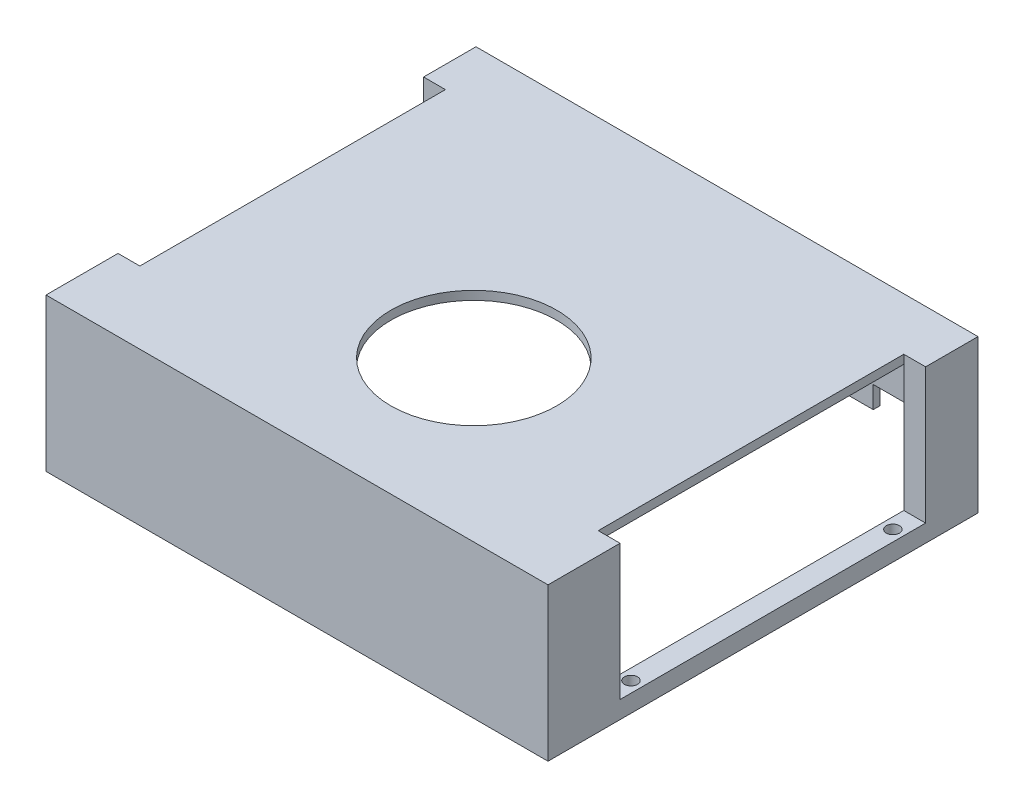
ISO-10303-21;
HEADER;
FILE_DESCRIPTION(('STEP AP214'),'2;1');
FILE_NAME('part.step','',(''),(''),'','','');
FILE_SCHEMA(('AUTOMOTIVE_DESIGN { 1 0 10303 214 1 1 1 1 }'));
ENDSEC;
DATA;
#1=APPLICATION_CONTEXT('core data for automotive mechanical design processes');
#2=APPLICATION_PROTOCOL_DEFINITION('international standard','automotive_design',2000,#1);
#3=PRODUCT_CONTEXT('',#1,'mechanical');
#4=PRODUCT('Part','Part','',(#3));
#5=PRODUCT_RELATED_PRODUCT_CATEGORY('part','',(#4));
#6=PRODUCT_DEFINITION_FORMATION('','',#4);
#7=PRODUCT_DEFINITION_CONTEXT('part definition',#1,'design');
#8=PRODUCT_DEFINITION('design','',#6,#7);
#9=PRODUCT_DEFINITION_SHAPE('','',#8);
#10=(LENGTH_UNIT() NAMED_UNIT(*) SI_UNIT(.MILLI.,.METRE.));
#11=(NAMED_UNIT(*) PLANE_ANGLE_UNIT() SI_UNIT($,.RADIAN.));
#12=(NAMED_UNIT(*) SI_UNIT($,.STERADIAN.) SOLID_ANGLE_UNIT());
#13=UNCERTAINTY_MEASURE_WITH_UNIT(LENGTH_MEASURE(1.E-05),#10,'distance_accuracy_value','');
#14=(GEOMETRIC_REPRESENTATION_CONTEXT(3) GLOBAL_UNCERTAINTY_ASSIGNED_CONTEXT((#13)) GLOBAL_UNIT_ASSIGNED_CONTEXT((#10,
#11,#12)) REPRESENTATION_CONTEXT('',''));
#15=CARTESIAN_POINT('',(0.,0.,0.));
#16=DIRECTION('',(0.,0.,1.));
#17=DIRECTION('',(1.,0.,0.));
#18=AXIS2_PLACEMENT_3D('',#15,#16,#17);
#19=CARTESIAN_POINT('',(-57.5,35.,-57.));
#20=DIRECTION('',(0.,0.,-1.));
#21=DIRECTION('',(-1.,0.,0.));
#22=AXIS2_PLACEMENT_3D('',#19,#20,#21);
#23=PLANE('',#22);
#24=DIRECTION('',(0.,-1.,0.));
#25=VECTOR('',#24,1.);
#26=CARTESIAN_POINT('',(50.,10.,-57.));
#27=LINE('',#26,#25);
#28=CARTESIAN_POINT('',(50.,15.,-57.));
#29=VERTEX_POINT('',#28);
#30=CARTESIAN_POINT('',(50.,0.,-57.));
#31=VERTEX_POINT('',#30);
#32=EDGE_CURVE('E224',#29,#31,#27,.T.);
#33=ORIENTED_EDGE('',*,*,#32,.F.);
#34=DIRECTION('',(1.,0.,0.));
#35=VECTOR('',#34,1.);
#36=CARTESIAN_POINT('',(50.,15.,-57.));
#37=LINE('',#36,#35);
#38=CARTESIAN_POINT('',(35.,15.,-57.));
#39=VERTEX_POINT('',#38);
#40=EDGE_CURVE('E235',#39,#29,#37,.T.);
#41=ORIENTED_EDGE('',*,*,#40,.F.);
#42=DIRECTION('',(0.,1.,0.));
#43=VECTOR('',#42,1.);
#44=CARTESIAN_POINT('',(35.,10.,-57.));
#45=LINE('',#44,#43);
#46=CARTESIAN_POINT('',(35.,10.,-57.));
#47=VERTEX_POINT('',#46);
#48=EDGE_CURVE('E328',#47,#39,#45,.T.);
#49=ORIENTED_EDGE('',*,*,#48,.F.);
#50=DIRECTION('',(1.,0.,0.));
#51=VECTOR('',#50,1.);
#52=CARTESIAN_POINT('',(35.,10.,-57.));
#53=LINE('',#52,#51);
#54=CARTESIAN_POINT('',(15.,10.,-57.));
#55=VERTEX_POINT('',#54);
#56=EDGE_CURVE('E633',#55,#47,#53,.T.);
#57=ORIENTED_EDGE('',*,*,#56,.F.);
#58=DIRECTION('',(0.,-1.,0.));
#59=VECTOR('',#58,1.);
#60=CARTESIAN_POINT('',(15.,10.,-57.));
#61=LINE('',#60,#59);
#62=CARTESIAN_POINT('',(15.,20.,-57.));
#63=VERTEX_POINT('',#62);
#64=EDGE_CURVE('E629',#63,#55,#61,.T.);
#65=ORIENTED_EDGE('',*,*,#64,.F.);
#66=DIRECTION('',(1.,0.,0.));
#67=VECTOR('',#66,1.);
#68=CARTESIAN_POINT('',(15.,20.,-57.));
#69=LINE('',#68,#67);
#70=CARTESIAN_POINT('',(-36.,20.,-57.));
#71=VERTEX_POINT('',#70);
#72=EDGE_CURVE('E625',#71,#63,#69,.T.);
#73=ORIENTED_EDGE('',*,*,#72,.F.);
#74=DIRECTION('',(0.,1.,0.));
#75=VECTOR('',#74,1.);
#76=CARTESIAN_POINT('',(-36.,10.,-57.));
#77=LINE('',#76,#75);
#78=CARTESIAN_POINT('',(-36.,10.,-57.));
#79=VERTEX_POINT('',#78);
#80=EDGE_CURVE('E615',#79,#71,#77,.T.);
#81=ORIENTED_EDGE('',*,*,#80,.F.);
#82=DIRECTION('',(1.,0.,0.));
#83=VECTOR('',#82,1.);
#84=CARTESIAN_POINT('',(-36.,10.,-57.));
#85=LINE('',#84,#83);
#86=CARTESIAN_POINT('',(-50.,10.,-57.));
#87=VERTEX_POINT('',#86);
#88=EDGE_CURVE('E609',#87,#79,#85,.T.);
#89=ORIENTED_EDGE('',*,*,#88,.F.);
#90=DIRECTION('',(0.,1.,0.));
#91=VECTOR('',#90,1.);
#92=CARTESIAN_POINT('',(-50.,0.,-57.));
#93=LINE('',#92,#91);
#94=CARTESIAN_POINT('',(-50.,0.,-57.));
#95=VERTEX_POINT('',#94);
#96=EDGE_CURVE('E605',#95,#87,#93,.T.);
#97=ORIENTED_EDGE('',*,*,#96,.F.);
#98=DIRECTION('',(1.,0.,0.));
#99=VECTOR('',#98,1.);
#100=CARTESIAN_POINT('',(-57.5,0.,-57.));
#101=LINE('',#100,#99);
#102=CARTESIAN_POINT('',(-57.5,0.,-57.));
#103=VERTEX_POINT('',#102);
#104=EDGE_CURVE('E253',#103,#95,#101,.T.);
#105=ORIENTED_EDGE('',*,*,#104,.F.);
#106=DIRECTION('',(0.,-1.,0.));
#107=VECTOR('',#106,1.);
#108=CARTESIAN_POINT('',(-57.5,35.,-57.));
#109=LINE('',#108,#107);
#110=CARTESIAN_POINT('',(-57.5,35.,-57.));
#111=VERTEX_POINT('',#110);
#112=EDGE_CURVE('E276',#111,#103,#109,.T.);
#113=ORIENTED_EDGE('',*,*,#112,.F.);
#114=DIRECTION('',(1.,0.,0.));
#115=VECTOR('',#114,1.);
#116=CARTESIAN_POINT('',(-57.5,35.,-57.));
#117=LINE('',#116,#115);
#118=CARTESIAN_POINT('',(57.5,35.,-57.));
#119=VERTEX_POINT('',#118);
#120=EDGE_CURVE('E275',#111,#119,#117,.T.);
#121=ORIENTED_EDGE('',*,*,#120,.T.);
#122=DIRECTION('',(0.,-1.,0.));
#123=VECTOR('',#122,1.);
#124=CARTESIAN_POINT('',(57.5,35.,-57.));
#125=LINE('',#124,#123);
#126=CARTESIAN_POINT('',(57.5,0.,-57.));
#127=VERTEX_POINT('',#126);
#128=EDGE_CURVE('E250',#119,#127,#125,.T.);
#129=ORIENTED_EDGE('',*,*,#128,.T.);
#130=EDGE_CURVE('E242',#31,#127,#101,.T.);
#131=ORIENTED_EDGE('',*,*,#130,.F.);
#132=EDGE_LOOP('',(#33,#41,#49,#57,#65,#73,#81,#89,#97,#105,#113,#121,#129,#131));
#133=FACE_BOUND('',#132,.T.);
#134=ADVANCED_FACE('F39',(#133),#23,.T.);
#135=CARTESIAN_POINT('',(-57.5,35.,-57.));
#136=DIRECTION('',(1.,0.,0.));
#137=DIRECTION('',(0.,0.,-1.));
#138=AXIS2_PLACEMENT_3D('',#135,#136,#137);
#139=PLANE('',#138);
#140=DIRECTION('',(0.,0.,1.));
#141=VECTOR('',#140,1.);
#142=CARTESIAN_POINT('',(-57.5,4.,-45.));
#143=LINE('',#142,#141);
#144=CARTESIAN_POINT('',(-57.5,4.,-45.));
#145=VERTEX_POINT('',#144);
#146=CARTESIAN_POINT('',(-57.5,4.,25.));
#147=VERTEX_POINT('',#146);
#148=EDGE_CURVE('E353',#145,#147,#143,.T.);
#149=ORIENTED_EDGE('',*,*,#148,.F.);
#150=DIRECTION('',(0.,1.,0.));
#151=VECTOR('',#150,1.);
#152=CARTESIAN_POINT('',(-57.5,4.,-45.));
#153=LINE('',#152,#151);
#154=CARTESIAN_POINT('',(-57.5,35.,-45.));
#155=VERTEX_POINT('',#154);
#156=EDGE_CURVE('E381',#145,#155,#153,.T.);
#157=ORIENTED_EDGE('',*,*,#156,.T.);
#158=DIRECTION('',(0.,0.,1.));
#159=VECTOR('',#158,1.);
#160=CARTESIAN_POINT('',(-57.5,35.,-57.));
#161=LINE('',#160,#159);
#162=EDGE_CURVE('E264',#111,#155,#161,.T.);
#163=ORIENTED_EDGE('',*,*,#162,.F.);
#164=ORIENTED_EDGE('',*,*,#112,.T.);
#165=DIRECTION('',(0.,0.,1.));
#166=VECTOR('',#165,1.);
#167=CARTESIAN_POINT('',(-57.5,0.,-57.));
#168=LINE('',#167,#166);
#169=CARTESIAN_POINT('',(-57.5,0.,41.5));
#170=VERTEX_POINT('',#169);
#171=EDGE_CURVE('E272',#103,#170,#168,.T.);
#172=ORIENTED_EDGE('',*,*,#171,.T.);
#173=DIRECTION('',(0.,-1.,0.));
#174=VECTOR('',#173,1.);
#175=CARTESIAN_POINT('',(-57.5,35.,41.5));
#176=LINE('',#175,#174);
#177=CARTESIAN_POINT('',(-57.5,35.,41.5));
#178=VERTEX_POINT('',#177);
#179=EDGE_CURVE('E280',#178,#170,#176,.T.);
#180=ORIENTED_EDGE('',*,*,#179,.F.);
#181=CARTESIAN_POINT('',(-57.5,35.,25.));
#182=VERTEX_POINT('',#181);
#183=EDGE_CURVE('E521',#182,#178,#161,.T.);
#184=ORIENTED_EDGE('',*,*,#183,.F.);
#185=DIRECTION('',(0.,1.,0.));
#186=VECTOR('',#185,1.);
#187=CARTESIAN_POINT('',(-57.5,4.,25.));
#188=LINE('',#187,#186);
#189=EDGE_CURVE('E369',#147,#182,#188,.T.);
#190=ORIENTED_EDGE('',*,*,#189,.F.);
#191=EDGE_LOOP('',(#149,#157,#163,#164,#172,#180,#184,#190));
#192=FACE_BOUND('',#191,.T.);
#193=ADVANCED_FACE('F540',(#192),#139,.F.);
#194=CARTESIAN_POINT('',(-57.5,35.,41.5));
#195=DIRECTION('',(0.,0.,-1.));
#196=DIRECTION('',(-1.,0.,0.));
#197=AXIS2_PLACEMENT_3D('',#194,#195,#196);
#198=PLANE('',#197);
#199=DIRECTION('',(1.,0.,0.));
#200=VECTOR('',#199,1.);
#201=CARTESIAN_POINT('',(-57.5,0.,41.5));
#202=LINE('',#201,#200);
#203=CARTESIAN_POINT('',(57.5,0.,41.5));
#204=VERTEX_POINT('',#203);
#205=EDGE_CURVE('E268',#170,#204,#202,.T.);
#206=ORIENTED_EDGE('',*,*,#205,.T.);
#207=DIRECTION('',(0.,-1.,0.));
#208=VECTOR('',#207,1.);
#209=CARTESIAN_POINT('',(57.5,35.,41.5));
#210=LINE('',#209,#208);
#211=CARTESIAN_POINT('',(57.5,35.,41.5));
#212=VERTEX_POINT('',#211);
#213=EDGE_CURVE('E284',#212,#204,#210,.T.);
#214=ORIENTED_EDGE('',*,*,#213,.F.);
#215=DIRECTION('',(1.,0.,0.));
#216=VECTOR('',#215,1.);
#217=CARTESIAN_POINT('',(-57.5,35.,41.5));
#218=LINE('',#217,#216);
#219=EDGE_CURVE('E518',#178,#212,#218,.T.);
#220=ORIENTED_EDGE('',*,*,#219,.F.);
#221=ORIENTED_EDGE('',*,*,#179,.T.);
#222=EDGE_LOOP('',(#206,#214,#220,#221));
#223=FACE_BOUND('',#222,.T.);
#224=ADVANCED_FACE('F670',(#223),#198,.F.);
#225=CARTESIAN_POINT('',(57.5,35.,-57.));
#226=DIRECTION('',(1.,0.,0.));
#227=DIRECTION('',(0.,0.,-1.));
#228=AXIS2_PLACEMENT_3D('',#225,#226,#227);
#229=PLANE('',#228);
#230=DIRECTION('',(0.,1.,0.));
#231=VECTOR('',#230,1.);
#232=CARTESIAN_POINT('',(57.5,4.,-45.));
#233=LINE('',#232,#231);
#234=CARTESIAN_POINT('',(57.5,4.,-45.));
#235=VERTEX_POINT('',#234);
#236=CARTESIAN_POINT('',(57.5,35.,-45.));
#237=VERTEX_POINT('',#236);
#238=EDGE_CURVE('E426',#235,#237,#233,.T.);
#239=ORIENTED_EDGE('',*,*,#238,.F.);
#240=DIRECTION('',(0.,0.,-1.));
#241=VECTOR('',#240,1.);
#242=CARTESIAN_POINT('',(57.5,4.,-45.));
#243=LINE('',#242,#241);
#244=CARTESIAN_POINT('',(57.5,4.,25.));
#245=VERTEX_POINT('',#244);
#246=EDGE_CURVE('E406',#245,#235,#243,.T.);
#247=ORIENTED_EDGE('',*,*,#246,.F.);
#248=DIRECTION('',(0.,1.,0.));
#249=VECTOR('',#248,1.);
#250=CARTESIAN_POINT('',(57.5,4.,25.));
#251=LINE('',#250,#249);
#252=CARTESIAN_POINT('',(57.5,35.,25.));
#253=VERTEX_POINT('',#252);
#254=EDGE_CURVE('E429',#245,#253,#251,.T.);
#255=ORIENTED_EDGE('',*,*,#254,.T.);
#256=DIRECTION('',(0.,0.,1.));
#257=VECTOR('',#256,1.);
#258=CARTESIAN_POINT('',(57.5,35.,-57.));
#259=LINE('',#258,#257);
#260=EDGE_CURVE('E514',#253,#212,#259,.T.);
#261=ORIENTED_EDGE('',*,*,#260,.T.);
#262=ORIENTED_EDGE('',*,*,#213,.T.);
#263=DIRECTION('',(0.,0.,1.));
#264=VECTOR('',#263,1.);
#265=CARTESIAN_POINT('',(57.5,0.,-57.));
#266=LINE('',#265,#264);
#267=EDGE_CURVE('E259',#127,#204,#266,.T.);
#268=ORIENTED_EDGE('',*,*,#267,.F.);
#269=ORIENTED_EDGE('',*,*,#128,.F.);
#270=EDGE_CURVE('E515',#119,#237,#259,.T.);
#271=ORIENTED_EDGE('',*,*,#270,.T.);
#272=EDGE_LOOP('',(#239,#247,#255,#261,#262,#268,#269,#271));
#273=FACE_BOUND('',#272,.T.);
#274=ADVANCED_FACE('F574',(#273),#229,.T.);
#275=CARTESIAN_POINT('',(0.,35.,0.));
#276=DIRECTION('',(0.,-1.,0.));
#277=DIRECTION('',(0.,0.,-1.));
#278=AXIS2_PLACEMENT_3D('',#275,#276,#277);
#279=PLANE('',#278);
#280=CARTESIAN_POINT('',(4.,35.,5.));
#281=DIRECTION('',(0.,1.,0.));
#282=DIRECTION('',(0.,0.,1.));
#283=AXIS2_PLACEMENT_3D('',#280,#281,#282);
#284=CIRCLE('',#283,19.);
#285=CARTESIAN_POINT('',(4.,35.,24.));
#286=VERTEX_POINT('',#285);
#287=EDGE_CURVE('E618',#286,#286,#284,.T.);
#288=ORIENTED_EDGE('',*,*,#287,.F.);
#289=EDGE_LOOP('',(#288));
#290=FACE_BOUND('',#289,.T.);
#291=ORIENTED_EDGE('',*,*,#162,.T.);
#292=DIRECTION('',(-1.,0.,0.));
#293=VECTOR('',#292,1.);
#294=CARTESIAN_POINT('',(-57.5,35.,-45.));
#295=LINE('',#294,#293);
#296=CARTESIAN_POINT('',(-52.5,35.,-45.));
#297=VERTEX_POINT('',#296);
#298=EDGE_CURVE('E358',#297,#155,#295,.T.);
#299=ORIENTED_EDGE('',*,*,#298,.F.);
#300=DIRECTION('',(0.,0.,-1.));
#301=VECTOR('',#300,1.);
#302=CARTESIAN_POINT('',(-52.5,35.,-45.));
#303=LINE('',#302,#301);
#304=CARTESIAN_POINT('',(-52.5,35.,25.));
#305=VERTEX_POINT('',#304);
#306=EDGE_CURVE('E374',#305,#297,#303,.T.);
#307=ORIENTED_EDGE('',*,*,#306,.F.);
#308=DIRECTION('',(1.,0.,0.));
#309=VECTOR('',#308,1.);
#310=CARTESIAN_POINT('',(-57.5,35.,25.));
#311=LINE('',#310,#309);
#312=EDGE_CURVE('E370',#182,#305,#311,.T.);
#313=ORIENTED_EDGE('',*,*,#312,.F.);
#314=ORIENTED_EDGE('',*,*,#183,.T.);
#315=ORIENTED_EDGE('',*,*,#219,.T.);
#316=ORIENTED_EDGE('',*,*,#260,.F.);
#317=DIRECTION('',(1.,0.,0.));
#318=VECTOR('',#317,1.);
#319=CARTESIAN_POINT('',(52.5,35.,25.));
#320=LINE('',#319,#318);
#321=CARTESIAN_POINT('',(52.5,35.,25.));
#322=VERTEX_POINT('',#321);
#323=EDGE_CURVE('E416',#322,#253,#320,.T.);
#324=ORIENTED_EDGE('',*,*,#323,.F.);
#325=DIRECTION('',(0.,0.,1.));
#326=VECTOR('',#325,1.);
#327=CARTESIAN_POINT('',(52.5,35.,-45.));
#328=LINE('',#327,#326);
#329=CARTESIAN_POINT('',(52.5,35.,-45.));
#330=VERTEX_POINT('',#329);
#331=EDGE_CURVE('E62',#330,#322,#328,.T.);
#332=ORIENTED_EDGE('',*,*,#331,.F.);
#333=DIRECTION('',(-1.,0.,0.));
#334=VECTOR('',#333,1.);
#335=CARTESIAN_POINT('',(52.5,35.,-45.));
#336=LINE('',#335,#334);
#337=EDGE_CURVE('E402',#237,#330,#336,.T.);
#338=ORIENTED_EDGE('',*,*,#337,.F.);
#339=ORIENTED_EDGE('',*,*,#270,.F.);
#340=ORIENTED_EDGE('',*,*,#120,.F.);
#341=EDGE_LOOP('',(#291,#299,#307,#313,#314,#315,#316,#324,#332,#338,#339,#340));
#342=FACE_BOUND('',#341,.T.);
#343=ADVANCED_FACE('F535',(#290,#342),#279,.F.);
#344=CARTESIAN_POINT('',(0.,0.,0.));
#345=DIRECTION('',(0.,-1.,0.));
#346=DIRECTION('',(0.,0.,-1.));
#347=AXIS2_PLACEMENT_3D('',#344,#345,#346);
#348=PLANE('',#347);
#349=DIRECTION('',(0.,0.,-1.));
#350=VECTOR('',#349,1.);
#351=CARTESIAN_POINT('',(50.,0.,-55.));
#352=LINE('',#351,#350);
#353=CARTESIAN_POINT('',(50.,0.,-55.5));
#354=VERTEX_POINT('',#353);
#355=EDGE_CURVE('E227',#354,#31,#352,.T.);
#356=ORIENTED_EDGE('',*,*,#355,.T.);
#357=ORIENTED_EDGE('',*,*,#130,.T.);
#358=ORIENTED_EDGE('',*,*,#267,.T.);
#359=ORIENTED_EDGE('',*,*,#205,.F.);
#360=ORIENTED_EDGE('',*,*,#171,.F.);
#361=ORIENTED_EDGE('',*,*,#104,.T.);
#362=DIRECTION('',(0.,0.,-1.));
#363=VECTOR('',#362,1.);
#364=CARTESIAN_POINT('',(-50.,0.,-55.));
#365=LINE('',#364,#363);
#366=CARTESIAN_POINT('',(-50.,0.,-55.5));
#367=VERTEX_POINT('',#366);
#368=EDGE_CURVE('E247',#367,#95,#365,.T.);
#369=ORIENTED_EDGE('',*,*,#368,.F.);
#370=DIRECTION('',(1.,0.,0.));
#371=VECTOR('',#370,1.);
#372=CARTESIAN_POINT('',(-52.5,0.,-55.5));
#373=LINE('',#372,#371);
#374=CARTESIAN_POINT('',(-52.5,0.,-55.5));
#375=VERTEX_POINT('',#374);
#376=EDGE_CURVE('E491',#375,#367,#373,.T.);
#377=ORIENTED_EDGE('',*,*,#376,.F.);
#378=DIRECTION('',(0.,0.,-1.));
#379=VECTOR('',#378,1.);
#380=CARTESIAN_POINT('',(-52.5,0.,36.5));
#381=LINE('',#380,#379);
#382=CARTESIAN_POINT('',(-52.5,0.,36.5));
#383=VERTEX_POINT('',#382);
#384=EDGE_CURVE('E467',#383,#375,#381,.T.);
#385=ORIENTED_EDGE('',*,*,#384,.F.);
#386=DIRECTION('',(-1.,0.,0.));
#387=VECTOR('',#386,1.);
#388=CARTESIAN_POINT('',(-52.5,0.,36.5));
#389=LINE('',#388,#387);
#390=CARTESIAN_POINT('',(52.5,0.,36.5));
#391=VERTEX_POINT('',#390);
#392=EDGE_CURVE('E499',#391,#383,#389,.T.);
#393=ORIENTED_EDGE('',*,*,#392,.F.);
#394=DIRECTION('',(0.,0.,1.));
#395=VECTOR('',#394,1.);
#396=CARTESIAN_POINT('',(52.5,0.,36.5));
#397=LINE('',#396,#395);
#398=CARTESIAN_POINT('',(52.5,0.,-55.5));
#399=VERTEX_POINT('',#398);
#400=EDGE_CURVE('E495',#399,#391,#397,.T.);
#401=ORIENTED_EDGE('',*,*,#400,.F.);
#402=EDGE_CURVE('E245',#354,#399,#373,.T.);
#403=ORIENTED_EDGE('',*,*,#402,.F.);
#404=EDGE_LOOP('',(#356,#357,#358,#359,#360,#361,#369,#377,#385,#393,#401,#403));
#405=FACE_BOUND('',#404,.T.);
#406=CARTESIAN_POINT('',(-55.,0.,-40.));
#407=DIRECTION('',(0.,-1.,0.));
#408=DIRECTION('',(0.,0.,-1.));
#409=AXIS2_PLACEMENT_3D('',#406,#407,#408);
#410=CIRCLE('',#409,1.5);
#411=CARTESIAN_POINT('',(-55.,0.,-41.5));
#412=VERTEX_POINT('',#411);
#413=EDGE_CURVE('E456',#412,#412,#410,.T.);
#414=ORIENTED_EDGE('',*,*,#413,.F.);
#415=EDGE_LOOP('',(#414));
#416=FACE_BOUND('',#415,.T.);
#417=CARTESIAN_POINT('',(55.,0.,20.));
#418=DIRECTION('',(0.,-1.,0.));
#419=DIRECTION('',(0.,0.,-1.));
#420=AXIS2_PLACEMENT_3D('',#417,#418,#419);
#421=CIRCLE('',#420,1.5);
#422=CARTESIAN_POINT('',(55.,0.,18.5));
#423=VERTEX_POINT('',#422);
#424=EDGE_CURVE('E455',#423,#423,#421,.T.);
#425=ORIENTED_EDGE('',*,*,#424,.F.);
#426=EDGE_LOOP('',(#425));
#427=FACE_BOUND('',#426,.T.);
#428=CARTESIAN_POINT('',(55.,0.,-40.));
#429=DIRECTION('',(0.,-1.,0.));
#430=DIRECTION('',(0.,0.,-1.));
#431=AXIS2_PLACEMENT_3D('',#428,#429,#430);
#432=CIRCLE('',#431,1.5);
#433=CARTESIAN_POINT('',(55.,0.,-41.5));
#434=VERTEX_POINT('',#433);
#435=EDGE_CURVE('E444',#434,#434,#432,.T.);
#436=ORIENTED_EDGE('',*,*,#435,.F.);
#437=EDGE_LOOP('',(#436));
#438=FACE_BOUND('',#437,.T.);
#439=CARTESIAN_POINT('',(-55.,0.,20.));
#440=DIRECTION('',(0.,-1.,0.));
#441=DIRECTION('',(0.,0.,-1.));
#442=AXIS2_PLACEMENT_3D('',#439,#440,#441);
#443=CIRCLE('',#442,1.5);
#444=CARTESIAN_POINT('',(-55.,0.,18.5));
#445=VERTEX_POINT('',#444);
#446=EDGE_CURVE('E460',#445,#445,#443,.T.);
#447=ORIENTED_EDGE('',*,*,#446,.F.);
#448=EDGE_LOOP('',(#447));
#449=FACE_BOUND('',#448,.T.);
#450=ADVANCED_FACE('F239',(#405,#416,#427,#438,#449),#348,.T.);
#451=CARTESIAN_POINT('',(-52.5,33.,36.5));
#452=DIRECTION('',(-1.,0.,0.));
#453=DIRECTION('',(0.,0.,1.));
#454=AXIS2_PLACEMENT_3D('',#451,#452,#453);
#455=PLANE('',#454);
#456=DIRECTION('',(0.,0.,-1.));
#457=VECTOR('',#456,1.);
#458=CARTESIAN_POINT('',(-52.5,33.,36.5));
#459=LINE('',#458,#457);
#460=CARTESIAN_POINT('',(-52.5,33.,-45.));
#461=VERTEX_POINT('',#460);
#462=CARTESIAN_POINT('',(-52.5,33.,-55.5));
#463=VERTEX_POINT('',#462);
#464=EDGE_CURVE('E474',#461,#463,#459,.T.);
#465=ORIENTED_EDGE('',*,*,#464,.F.);
#466=DIRECTION('',(0.,1.,0.));
#467=VECTOR('',#466,1.);
#468=CARTESIAN_POINT('',(-52.5,4.,-45.));
#469=LINE('',#468,#467);
#470=CARTESIAN_POINT('',(-52.5,4.,-45.));
#471=VERTEX_POINT('',#470);
#472=EDGE_CURVE('E386',#471,#461,#469,.T.);
#473=ORIENTED_EDGE('',*,*,#472,.F.);
#474=DIRECTION('',(0.,0.,-1.));
#475=VECTOR('',#474,1.);
#476=CARTESIAN_POINT('',(-52.5,4.,-45.));
#477=LINE('',#476,#475);
#478=CARTESIAN_POINT('',(-52.5,4.,25.));
#479=VERTEX_POINT('',#478);
#480=EDGE_CURVE('E362',#479,#471,#477,.T.);
#481=ORIENTED_EDGE('',*,*,#480,.F.);
#482=DIRECTION('',(0.,1.,0.));
#483=VECTOR('',#482,1.);
#484=CARTESIAN_POINT('',(-52.5,4.,25.));
#485=LINE('',#484,#483);
#486=CARTESIAN_POINT('',(-52.5,33.,25.));
#487=VERTEX_POINT('',#486);
#488=EDGE_CURVE('E390',#479,#487,#485,.T.);
#489=ORIENTED_EDGE('',*,*,#488,.T.);
#490=CARTESIAN_POINT('',(-52.5,33.,36.5));
#491=VERTEX_POINT('',#490);
#492=EDGE_CURVE('E468',#491,#487,#459,.T.);
#493=ORIENTED_EDGE('',*,*,#492,.F.);
#494=DIRECTION('',(0.,-1.,0.));
#495=VECTOR('',#494,1.);
#496=CARTESIAN_POINT('',(-52.5,33.,36.5));
#497=LINE('',#496,#495);
#498=EDGE_CURVE('E254',#491,#383,#497,.T.);
#499=ORIENTED_EDGE('',*,*,#498,.T.);
#500=ORIENTED_EDGE('',*,*,#384,.T.);
#501=DIRECTION('',(0.,-1.,0.));
#502=VECTOR('',#501,1.);
#503=CARTESIAN_POINT('',(-52.5,33.,-55.5));
#504=LINE('',#503,#502);
#505=EDGE_CURVE('E488',#463,#375,#504,.T.);
#506=ORIENTED_EDGE('',*,*,#505,.F.);
#507=EDGE_LOOP('',(#465,#473,#481,#489,#493,#499,#500,#506));
#508=FACE_BOUND('',#507,.T.);
#509=ADVANCED_FACE('F553',(#508),#455,.F.);
#510=CARTESIAN_POINT('',(-52.5,33.,36.5));
#511=DIRECTION('',(0.,0.,1.));
#512=DIRECTION('',(1.,0.,0.));
#513=AXIS2_PLACEMENT_3D('',#510,#511,#512);
#514=PLANE('',#513);
#515=ORIENTED_EDGE('',*,*,#392,.T.);
#516=ORIENTED_EDGE('',*,*,#498,.F.);
#517=DIRECTION('',(-1.,0.,0.));
#518=VECTOR('',#517,1.);
#519=CARTESIAN_POINT('',(-52.5,33.,36.5));
#520=LINE('',#519,#518);
#521=CARTESIAN_POINT('',(52.5,33.,36.5));
#522=VERTEX_POINT('',#521);
#523=EDGE_CURVE('E483',#522,#491,#520,.T.);
#524=ORIENTED_EDGE('',*,*,#523,.F.);
#525=DIRECTION('',(0.,-1.,0.));
#526=VECTOR('',#525,1.);
#527=CARTESIAN_POINT('',(52.5,33.,36.5));
#528=LINE('',#527,#526);
#529=EDGE_CURVE('E260',#522,#391,#528,.T.);
#530=ORIENTED_EDGE('',*,*,#529,.T.);
#531=EDGE_LOOP('',(#515,#516,#524,#530));
#532=FACE_BOUND('',#531,.T.);
#533=ADVANCED_FACE('F600',(#532),#514,.F.);
#534=CARTESIAN_POINT('',(52.5,33.,36.5));
#535=DIRECTION('',(1.,0.,0.));
#536=DIRECTION('',(0.,0.,-1.));
#537=AXIS2_PLACEMENT_3D('',#534,#535,#536);
#538=PLANE('',#537);
#539=DIRECTION('',(0.,0.,1.));
#540=VECTOR('',#539,1.);
#541=CARTESIAN_POINT('',(52.5,4.,-45.));
#542=LINE('',#541,#540);
#543=CARTESIAN_POINT('',(52.5,4.,-45.));
#544=VERTEX_POINT('',#543);
#545=CARTESIAN_POINT('',(52.5,4.,25.));
#546=VERTEX_POINT('',#545);
#547=EDGE_CURVE('E397',#544,#546,#542,.T.);
#548=ORIENTED_EDGE('',*,*,#547,.F.);
#549=DIRECTION('',(0.,1.,0.));
#550=VECTOR('',#549,1.);
#551=CARTESIAN_POINT('',(52.5,4.,-45.));
#552=LINE('',#551,#550);
#553=CARTESIAN_POINT('',(52.5,33.,-45.));
#554=VERTEX_POINT('',#553);
#555=EDGE_CURVE('E375',#544,#554,#552,.T.);
#556=ORIENTED_EDGE('',*,*,#555,.T.);
#557=DIRECTION('',(0.,0.,1.));
#558=VECTOR('',#557,1.);
#559=CARTESIAN_POINT('',(52.5,33.,36.5));
#560=LINE('',#559,#558);
#561=CARTESIAN_POINT('',(52.5,33.,-55.5));
#562=VERTEX_POINT('',#561);
#563=EDGE_CURVE('E479',#562,#554,#560,.T.);
#564=ORIENTED_EDGE('',*,*,#563,.F.);
#565=DIRECTION('',(0.,-1.,0.));
#566=VECTOR('',#565,1.);
#567=CARTESIAN_POINT('',(52.5,33.,-55.5));
#568=LINE('',#567,#566);
#569=EDGE_CURVE('E505',#562,#399,#568,.T.);
#570=ORIENTED_EDGE('',*,*,#569,.T.);
#571=ORIENTED_EDGE('',*,*,#400,.T.);
#572=ORIENTED_EDGE('',*,*,#529,.F.);
#573=CARTESIAN_POINT('',(52.5,33.,25.));
#574=VERTEX_POINT('',#573);
#575=EDGE_CURVE('E478',#574,#522,#560,.T.);
#576=ORIENTED_EDGE('',*,*,#575,.F.);
#577=DIRECTION('',(0.,1.,0.));
#578=VECTOR('',#577,1.);
#579=CARTESIAN_POINT('',(52.5,4.,25.));
#580=LINE('',#579,#578);
#581=EDGE_CURVE('E433',#546,#574,#580,.T.);
#582=ORIENTED_EDGE('',*,*,#581,.F.);
#583=EDGE_LOOP('',(#548,#556,#564,#570,#571,#572,#576,#582));
#584=FACE_BOUND('',#583,.T.);
#585=ADVANCED_FACE('F582',(#584),#538,.F.);
#586=CARTESIAN_POINT('',(-52.5,33.,-55.5));
#587=DIRECTION('',(0.,0.,-1.));
#588=DIRECTION('',(-1.,0.,0.));
#589=AXIS2_PLACEMENT_3D('',#586,#587,#588);
#590=PLANE('',#589);
#591=DIRECTION('',(1.,0.,0.));
#592=VECTOR('',#591,1.);
#593=CARTESIAN_POINT('',(-52.5,15.,-55.5));
#594=LINE('',#593,#592);
#595=CARTESIAN_POINT('',(35.,15.,-55.5));
#596=VERTEX_POINT('',#595);
#597=CARTESIAN_POINT('',(50.,15.,-55.5));
#598=VERTEX_POINT('',#597);
#599=EDGE_CURVE('E47',#596,#598,#594,.T.);
#600=ORIENTED_EDGE('',*,*,#599,.T.);
#601=DIRECTION('',(0.,-1.,0.));
#602=VECTOR('',#601,1.);
#603=CARTESIAN_POINT('',(50.,33.,-55.5));
#604=LINE('',#603,#602);
#605=EDGE_CURVE('E11',#598,#354,#604,.T.);
#606=ORIENTED_EDGE('',*,*,#605,.T.);
#607=ORIENTED_EDGE('',*,*,#402,.T.);
#608=ORIENTED_EDGE('',*,*,#569,.F.);
#609=DIRECTION('',(1.,0.,0.));
#610=VECTOR('',#609,1.);
#611=CARTESIAN_POINT('',(-52.5,33.,-55.5));
#612=LINE('',#611,#610);
#613=EDGE_CURVE('E472',#463,#562,#612,.T.);
#614=ORIENTED_EDGE('',*,*,#613,.F.);
#615=ORIENTED_EDGE('',*,*,#505,.T.);
#616=ORIENTED_EDGE('',*,*,#376,.T.);
#617=DIRECTION('',(0.,1.,0.));
#618=VECTOR('',#617,1.);
#619=CARTESIAN_POINT('',(-50.,33.,-55.5));
#620=LINE('',#619,#618);
#621=CARTESIAN_POINT('',(-50.,10.,-55.5));
#622=VERTEX_POINT('',#621);
#623=EDGE_CURVE('E279',#367,#622,#620,.T.);
#624=ORIENTED_EDGE('',*,*,#623,.T.);
#625=DIRECTION('',(1.,0.,0.));
#626=VECTOR('',#625,1.);
#627=CARTESIAN_POINT('',(-52.5,10.,-55.5));
#628=LINE('',#627,#626);
#629=CARTESIAN_POINT('',(-36.,10.,-55.5));
#630=VERTEX_POINT('',#629);
#631=EDGE_CURVE('E292',#622,#630,#628,.T.);
#632=ORIENTED_EDGE('',*,*,#631,.T.);
#633=DIRECTION('',(0.,1.,0.));
#634=VECTOR('',#633,1.);
#635=CARTESIAN_POINT('',(-36.,33.,-55.5));
#636=LINE('',#635,#634);
#637=CARTESIAN_POINT('',(-36.,20.,-55.5));
#638=VERTEX_POINT('',#637);
#639=EDGE_CURVE('E296',#630,#638,#636,.T.);
#640=ORIENTED_EDGE('',*,*,#639,.T.);
#641=DIRECTION('',(1.,0.,0.));
#642=VECTOR('',#641,1.);
#643=CARTESIAN_POINT('',(-52.5,20.,-55.5));
#644=LINE('',#643,#642);
#645=CARTESIAN_POINT('',(15.,20.,-55.5));
#646=VERTEX_POINT('',#645);
#647=EDGE_CURVE('E300',#638,#646,#644,.T.);
#648=ORIENTED_EDGE('',*,*,#647,.T.);
#649=DIRECTION('',(0.,-1.,0.));
#650=VECTOR('',#649,1.);
#651=CARTESIAN_POINT('',(15.,33.,-55.5));
#652=LINE('',#651,#650);
#653=CARTESIAN_POINT('',(15.,10.,-55.5));
#654=VERTEX_POINT('',#653);
#655=EDGE_CURVE('E304',#646,#654,#652,.T.);
#656=ORIENTED_EDGE('',*,*,#655,.T.);
#657=DIRECTION('',(1.,0.,0.));
#658=VECTOR('',#657,1.);
#659=CARTESIAN_POINT('',(-52.5,10.,-55.5));
#660=LINE('',#659,#658);
#661=CARTESIAN_POINT('',(35.,10.,-55.5));
#662=VERTEX_POINT('',#661);
#663=EDGE_CURVE('E308',#654,#662,#660,.T.);
#664=ORIENTED_EDGE('',*,*,#663,.T.);
#665=DIRECTION('',(0.,1.,0.));
#666=VECTOR('',#665,1.);
#667=CARTESIAN_POINT('',(35.,33.,-55.5));
#668=LINE('',#667,#666);
#669=EDGE_CURVE('E312',#662,#596,#668,.T.);
#670=ORIENTED_EDGE('',*,*,#669,.T.);
#671=EDGE_LOOP('',(#600,#606,#607,#608,#614,#615,#616,#624,#632,#640,#648,#656,#664,#670));
#672=FACE_BOUND('',#671,.T.);
#673=ADVANCED_FACE('F318',(#672),#590,.F.);
#674=CARTESIAN_POINT('',(0.,33.,0.));
#675=DIRECTION('',(0.,-1.,0.));
#676=DIRECTION('',(0.,0.,-1.));
#677=AXIS2_PLACEMENT_3D('',#674,#675,#676);
#678=PLANE('',#677);
#679=CARTESIAN_POINT('',(4.,33.,5.));
#680=DIRECTION('',(0.,1.,0.));
#681=DIRECTION('',(0.,0.,1.));
#682=AXIS2_PLACEMENT_3D('',#679,#680,#681);
#683=CIRCLE('',#682,19.);
#684=CARTESIAN_POINT('',(4.,33.,24.));
#685=VERTEX_POINT('',#684);
#686=EDGE_CURVE('E611',#685,#685,#683,.T.);
#687=ORIENTED_EDGE('',*,*,#686,.T.);
#688=EDGE_LOOP('',(#687));
#689=FACE_BOUND('',#688,.T.);
#690=ORIENTED_EDGE('',*,*,#492,.T.);
#691=EDGE_CURVE('E473',#487,#461,#459,.T.);
#692=ORIENTED_EDGE('',*,*,#691,.T.);
#693=ORIENTED_EDGE('',*,*,#464,.T.);
#694=ORIENTED_EDGE('',*,*,#613,.T.);
#695=ORIENTED_EDGE('',*,*,#563,.T.);
#696=EDGE_CURVE('E484',#554,#574,#560,.T.);
#697=ORIENTED_EDGE('',*,*,#696,.T.);
#698=ORIENTED_EDGE('',*,*,#575,.T.);
#699=ORIENTED_EDGE('',*,*,#523,.T.);
#700=EDGE_LOOP('',(#690,#692,#693,#694,#695,#697,#698,#699));
#701=FACE_BOUND('',#700,.T.);
#702=ADVANCED_FACE('F588',(#689,#701),#678,.T.);
#703=CARTESIAN_POINT('',(-55.,3.,20.));
#704=DIRECTION('',(0.,-1.,0.));
#705=DIRECTION('',(0.,0.,-1.));
#706=AXIS2_PLACEMENT_3D('',#703,#704,#705);
#707=CYLINDRICAL_SURFACE('',#706,1.5);
#708=ORIENTED_EDGE('',*,*,#446,.T.);
#709=EDGE_LOOP('',(#708));
#710=FACE_BOUND('',#709,.T.);
#711=CARTESIAN_POINT('',(-55.,4.,20.));
#712=DIRECTION('',(0.,-1.,0.));
#713=DIRECTION('',(0.,0.,-1.));
#714=AXIS2_PLACEMENT_3D('',#711,#712,#713);
#715=CIRCLE('',#714,1.5);
#716=CARTESIAN_POINT('',(-55.,4.,18.5));
#717=VERTEX_POINT('',#716);
#718=EDGE_CURVE('E445',#717,#717,#715,.T.);
#719=ORIENTED_EDGE('',*,*,#718,.F.);
#720=EDGE_LOOP('',(#719));
#721=FACE_BOUND('',#720,.T.);
#722=ADVANCED_FACE('F699',(#710,#721),#707,.F.);
#723=CARTESIAN_POINT('',(55.,3.,-40.));
#724=DIRECTION('',(0.,-1.,0.));
#725=DIRECTION('',(0.,0.,-1.));
#726=AXIS2_PLACEMENT_3D('',#723,#724,#725);
#727=CYLINDRICAL_SURFACE('',#726,1.5);
#728=ORIENTED_EDGE('',*,*,#435,.T.);
#729=EDGE_LOOP('',(#728));
#730=FACE_BOUND('',#729,.T.);
#731=CARTESIAN_POINT('',(55.,4.,-40.));
#732=DIRECTION('',(0.,-1.,0.));
#733=DIRECTION('',(0.,0.,-1.));
#734=AXIS2_PLACEMENT_3D('',#731,#732,#733);
#735=CIRCLE('',#734,1.5);
#736=CARTESIAN_POINT('',(55.,4.,-41.5));
#737=VERTEX_POINT('',#736);
#738=EDGE_CURVE('E385',#737,#737,#735,.T.);
#739=ORIENTED_EDGE('',*,*,#738,.F.);
#740=EDGE_LOOP('',(#739));
#741=FACE_BOUND('',#740,.T.);
#742=ADVANCED_FACE('F703',(#730,#741),#727,.F.);
#743=CARTESIAN_POINT('',(55.,3.,20.));
#744=DIRECTION('',(0.,-1.,0.));
#745=DIRECTION('',(0.,0.,-1.));
#746=AXIS2_PLACEMENT_3D('',#743,#744,#745);
#747=CYLINDRICAL_SURFACE('',#746,1.5);
#748=ORIENTED_EDGE('',*,*,#424,.T.);
#749=EDGE_LOOP('',(#748));
#750=FACE_BOUND('',#749,.T.);
#751=CARTESIAN_POINT('',(55.,4.,20.));
#752=DIRECTION('',(0.,-1.,0.));
#753=DIRECTION('',(0.,0.,-1.));
#754=AXIS2_PLACEMENT_3D('',#751,#752,#753);
#755=CIRCLE('',#754,1.5);
#756=CARTESIAN_POINT('',(55.,4.,18.5));
#757=VERTEX_POINT('',#756);
#758=EDGE_CURVE('E439',#757,#757,#755,.T.);
#759=ORIENTED_EDGE('',*,*,#758,.F.);
#760=EDGE_LOOP('',(#759));
#761=FACE_BOUND('',#760,.T.);
#762=ADVANCED_FACE('F705',(#750,#761),#747,.F.);
#763=CARTESIAN_POINT('',(-55.,3.,-40.));
#764=DIRECTION('',(0.,-1.,0.));
#765=DIRECTION('',(0.,0.,-1.));
#766=AXIS2_PLACEMENT_3D('',#763,#764,#765);
#767=CYLINDRICAL_SURFACE('',#766,1.5);
#768=ORIENTED_EDGE('',*,*,#413,.T.);
#769=EDGE_LOOP('',(#768));
#770=FACE_BOUND('',#769,.T.);
#771=CARTESIAN_POINT('',(-55.,4.,-40.));
#772=DIRECTION('',(0.,-1.,0.));
#773=DIRECTION('',(0.,0.,-1.));
#774=AXIS2_PLACEMENT_3D('',#771,#772,#773);
#775=CIRCLE('',#774,1.5);
#776=CARTESIAN_POINT('',(-55.,4.,-41.5));
#777=VERTEX_POINT('',#776);
#778=EDGE_CURVE('E440',#777,#777,#775,.T.);
#779=ORIENTED_EDGE('',*,*,#778,.F.);
#780=EDGE_LOOP('',(#779));
#781=FACE_BOUND('',#780,.T.);
#782=ADVANCED_FACE('F708',(#770,#781),#767,.F.);
#783=CARTESIAN_POINT('',(0.,4.,0.));
#784=DIRECTION('',(0.,1.,0.));
#785=DIRECTION('',(0.,0.,1.));
#786=AXIS2_PLACEMENT_3D('',#783,#784,#785);
#787=PLANE('',#786);
#788=ORIENTED_EDGE('',*,*,#547,.T.);
#789=DIRECTION('',(1.,0.,0.));
#790=VECTOR('',#789,1.);
#791=CARTESIAN_POINT('',(52.5,4.,25.));
#792=LINE('',#791,#790);
#793=EDGE_CURVE('E401',#546,#245,#792,.T.);
#794=ORIENTED_EDGE('',*,*,#793,.T.);
#795=ORIENTED_EDGE('',*,*,#246,.T.);
#796=DIRECTION('',(-1.,0.,0.));
#797=VECTOR('',#796,1.);
#798=CARTESIAN_POINT('',(52.5,4.,-45.));
#799=LINE('',#798,#797);
#800=EDGE_CURVE('E409',#235,#544,#799,.T.);
#801=ORIENTED_EDGE('',*,*,#800,.T.);
#802=EDGE_LOOP('',(#788,#794,#795,#801));
#803=FACE_BOUND('',#802,.T.);
#804=ORIENTED_EDGE('',*,*,#738,.T.);
#805=EDGE_LOOP('',(#804));
#806=FACE_BOUND('',#805,.T.);
#807=ORIENTED_EDGE('',*,*,#758,.T.);
#808=EDGE_LOOP('',(#807));
#809=FACE_BOUND('',#808,.T.);
#810=ADVANCED_FACE('F577',(#803,#806,#809),#787,.T.);
#811=CARTESIAN_POINT('',(52.5,4.,-45.));
#812=DIRECTION('',(-1.,0.,0.));
#813=DIRECTION('',(0.,0.,1.));
#814=AXIS2_PLACEMENT_3D('',#811,#812,#813);
#815=PLANE('',#814);
#816=ORIENTED_EDGE('',*,*,#696,.F.);
#817=EDGE_CURVE('E425',#554,#330,#552,.T.);
#818=ORIENTED_EDGE('',*,*,#817,.T.);
#819=ORIENTED_EDGE('',*,*,#331,.T.);
#820=EDGE_CURVE('E413',#574,#322,#580,.T.);
#821=ORIENTED_EDGE('',*,*,#820,.F.);
#822=EDGE_LOOP('',(#816,#818,#819,#821));
#823=FACE_BOUND('',#822,.T.);
#824=ADVANCED_FACE('F716',(#823),#815,.F.);
#825=CARTESIAN_POINT('',(52.5,4.,-45.));
#826=DIRECTION('',(0.,0.,-1.));
#827=DIRECTION('',(-1.,0.,0.));
#828=AXIS2_PLACEMENT_3D('',#825,#826,#827);
#829=PLANE('',#828);
#830=ORIENTED_EDGE('',*,*,#337,.T.);
#831=ORIENTED_EDGE('',*,*,#817,.F.);
#832=ORIENTED_EDGE('',*,*,#555,.F.);
#833=ORIENTED_EDGE('',*,*,#800,.F.);
#834=ORIENTED_EDGE('',*,*,#238,.T.);
#835=EDGE_LOOP('',(#830,#831,#832,#833,#834));
#836=FACE_BOUND('',#835,.T.);
#837=ADVANCED_FACE('F719',(#836),#829,.F.);
#838=CARTESIAN_POINT('',(52.5,4.,25.));
#839=DIRECTION('',(0.,0.,1.));
#840=DIRECTION('',(1.,0.,0.));
#841=AXIS2_PLACEMENT_3D('',#838,#839,#840);
#842=PLANE('',#841);
#843=ORIENTED_EDGE('',*,*,#323,.T.);
#844=ORIENTED_EDGE('',*,*,#254,.F.);
#845=ORIENTED_EDGE('',*,*,#793,.F.);
#846=ORIENTED_EDGE('',*,*,#581,.T.);
#847=ORIENTED_EDGE('',*,*,#820,.T.);
#848=EDGE_LOOP('',(#843,#844,#845,#846,#847));
#849=FACE_BOUND('',#848,.T.);
#850=ADVANCED_FACE('F567',(#849),#842,.F.);
#851=CARTESIAN_POINT('',(0.,4.,0.));
#852=DIRECTION('',(0.,1.,0.));
#853=DIRECTION('',(0.,0.,1.));
#854=AXIS2_PLACEMENT_3D('',#851,#852,#853);
#855=PLANE('',#854);
#856=ORIENTED_EDGE('',*,*,#148,.T.);
#857=DIRECTION('',(1.,0.,0.));
#858=VECTOR('',#857,1.);
#859=CARTESIAN_POINT('',(-57.5,4.,25.));
#860=LINE('',#859,#858);
#861=EDGE_CURVE('E357',#147,#479,#860,.T.);
#862=ORIENTED_EDGE('',*,*,#861,.T.);
#863=ORIENTED_EDGE('',*,*,#480,.T.);
#864=DIRECTION('',(-1.,0.,0.));
#865=VECTOR('',#864,1.);
#866=CARTESIAN_POINT('',(-57.5,4.,-45.));
#867=LINE('',#866,#865);
#868=EDGE_CURVE('E365',#471,#145,#867,.T.);
#869=ORIENTED_EDGE('',*,*,#868,.T.);
#870=EDGE_LOOP('',(#856,#862,#863,#869));
#871=FACE_BOUND('',#870,.T.);
#872=ORIENTED_EDGE('',*,*,#718,.T.);
#873=EDGE_LOOP('',(#872));
#874=FACE_BOUND('',#873,.T.);
#875=ORIENTED_EDGE('',*,*,#778,.T.);
#876=EDGE_LOOP('',(#875));
#877=FACE_BOUND('',#876,.T.);
#878=ADVANCED_FACE('F548',(#871,#874,#877),#855,.T.);
#879=CARTESIAN_POINT('',(-57.5,4.,-45.));
#880=DIRECTION('',(0.,0.,-1.));
#881=DIRECTION('',(-1.,0.,0.));
#882=AXIS2_PLACEMENT_3D('',#879,#880,#881);
#883=PLANE('',#882);
#884=ORIENTED_EDGE('',*,*,#298,.T.);
#885=ORIENTED_EDGE('',*,*,#156,.F.);
#886=ORIENTED_EDGE('',*,*,#868,.F.);
#887=ORIENTED_EDGE('',*,*,#472,.T.);
#888=EDGE_CURVE('E389',#461,#297,#469,.T.);
#889=ORIENTED_EDGE('',*,*,#888,.T.);
#890=EDGE_LOOP('',(#884,#885,#886,#887,#889));
#891=FACE_BOUND('',#890,.T.);
#892=ADVANCED_FACE('F545',(#891),#883,.F.);
#893=CARTESIAN_POINT('',(-52.5,4.,-45.));
#894=DIRECTION('',(1.,0.,0.));
#895=DIRECTION('',(0.,0.,-1.));
#896=AXIS2_PLACEMENT_3D('',#893,#894,#895);
#897=PLANE('',#896);
#898=ORIENTED_EDGE('',*,*,#691,.F.);
#899=EDGE_CURVE('E394',#487,#305,#485,.T.);
#900=ORIENTED_EDGE('',*,*,#899,.T.);
#901=ORIENTED_EDGE('',*,*,#306,.T.);
#902=ORIENTED_EDGE('',*,*,#888,.F.);
#903=EDGE_LOOP('',(#898,#900,#901,#902));
#904=FACE_BOUND('',#903,.T.);
#905=ADVANCED_FACE('F559',(#904),#897,.F.);
#906=CARTESIAN_POINT('',(-57.5,4.,25.));
#907=DIRECTION('',(0.,0.,1.));
#908=DIRECTION('',(1.,0.,0.));
#909=AXIS2_PLACEMENT_3D('',#906,#907,#908);
#910=PLANE('',#909);
#911=ORIENTED_EDGE('',*,*,#312,.T.);
#912=ORIENTED_EDGE('',*,*,#899,.F.);
#913=ORIENTED_EDGE('',*,*,#488,.F.);
#914=ORIENTED_EDGE('',*,*,#861,.F.);
#915=ORIENTED_EDGE('',*,*,#189,.T.);
#916=EDGE_LOOP('',(#911,#912,#913,#914,#915));
#917=FACE_BOUND('',#916,.T.);
#918=ADVANCED_FACE('F727',(#917),#910,.F.);
#919=CARTESIAN_POINT('',(50.,10.,-55.));
#920=DIRECTION('',(1.,0.,0.));
#921=DIRECTION('',(0.,0.,-1.));
#922=AXIS2_PLACEMENT_3D('',#919,#920,#921);
#923=PLANE('',#922);
#924=DIRECTION('',(0.,0.,-1.));
#925=VECTOR('',#924,1.);
#926=CARTESIAN_POINT('',(50.,15.,-55.));
#927=LINE('',#926,#925);
#928=EDGE_CURVE('E229',#598,#29,#927,.T.);
#929=ORIENTED_EDGE('',*,*,#928,.T.);
#930=ORIENTED_EDGE('',*,*,#32,.T.);
#931=ORIENTED_EDGE('',*,*,#355,.F.);
#932=ORIENTED_EDGE('',*,*,#605,.F.);
#933=EDGE_LOOP('',(#929,#930,#931,#932));
#934=FACE_BOUND('',#933,.T.);
#935=ADVANCED_FACE('F226',(#934),#923,.F.);
#936=CARTESIAN_POINT('',(50.,15.,-55.));
#937=DIRECTION('',(0.,1.,0.));
#938=DIRECTION('',(0.,0.,1.));
#939=AXIS2_PLACEMENT_3D('',#936,#937,#938);
#940=PLANE('',#939);
#941=DIRECTION('',(0.,0.,-1.));
#942=VECTOR('',#941,1.);
#943=CARTESIAN_POINT('',(35.,15.,-55.));
#944=LINE('',#943,#942);
#945=EDGE_CURVE('E322',#596,#39,#944,.T.);
#946=ORIENTED_EDGE('',*,*,#945,.T.);
#947=ORIENTED_EDGE('',*,*,#40,.T.);
#948=ORIENTED_EDGE('',*,*,#928,.F.);
#949=ORIENTED_EDGE('',*,*,#599,.F.);
#950=EDGE_LOOP('',(#946,#947,#948,#949));
#951=FACE_BOUND('',#950,.T.);
#952=ADVANCED_FACE('F321',(#951),#940,.F.);
#953=CARTESIAN_POINT('',(35.,10.,-55.));
#954=DIRECTION('',(-1.,0.,0.));
#955=DIRECTION('',(0.,0.,1.));
#956=AXIS2_PLACEMENT_3D('',#953,#954,#955);
#957=PLANE('',#956);
#958=DIRECTION('',(0.,0.,-1.));
#959=VECTOR('',#958,1.);
#960=CARTESIAN_POINT('',(35.,10.,-55.));
#961=LINE('',#960,#959);
#962=EDGE_CURVE('E330',#662,#47,#961,.T.);
#963=ORIENTED_EDGE('',*,*,#962,.T.);
#964=ORIENTED_EDGE('',*,*,#48,.T.);
#965=ORIENTED_EDGE('',*,*,#945,.F.);
#966=ORIENTED_EDGE('',*,*,#669,.F.);
#967=EDGE_LOOP('',(#963,#964,#965,#966));
#968=FACE_BOUND('',#967,.T.);
#969=ADVANCED_FACE('F325',(#968),#957,.F.);
#970=CARTESIAN_POINT('',(35.,10.,-55.));
#971=DIRECTION('',(0.,1.,0.));
#972=DIRECTION('',(0.,0.,1.));
#973=AXIS2_PLACEMENT_3D('',#970,#971,#972);
#974=PLANE('',#973);
#975=DIRECTION('',(0.,0.,-1.));
#976=VECTOR('',#975,1.);
#977=CARTESIAN_POINT('',(15.,10.,-55.));
#978=LINE('',#977,#976);
#979=EDGE_CURVE('E335',#654,#55,#978,.T.);
#980=ORIENTED_EDGE('',*,*,#979,.T.);
#981=ORIENTED_EDGE('',*,*,#56,.T.);
#982=ORIENTED_EDGE('',*,*,#962,.F.);
#983=ORIENTED_EDGE('',*,*,#663,.F.);
#984=EDGE_LOOP('',(#980,#981,#982,#983));
#985=FACE_BOUND('',#984,.T.);
#986=ADVANCED_FACE('F644',(#985),#974,.F.);
#987=CARTESIAN_POINT('',(15.,10.,-55.));
#988=DIRECTION('',(1.,0.,0.));
#989=DIRECTION('',(0.,0.,-1.));
#990=AXIS2_PLACEMENT_3D('',#987,#988,#989);
#991=PLANE('',#990);
#992=DIRECTION('',(0.,0.,-1.));
#993=VECTOR('',#992,1.);
#994=CARTESIAN_POINT('',(15.,20.,-55.));
#995=LINE('',#994,#993);
#996=EDGE_CURVE('E340',#646,#63,#995,.T.);
#997=ORIENTED_EDGE('',*,*,#996,.T.);
#998=ORIENTED_EDGE('',*,*,#64,.T.);
#999=ORIENTED_EDGE('',*,*,#979,.F.);
#1000=ORIENTED_EDGE('',*,*,#655,.F.);
#1001=EDGE_LOOP('',(#997,#998,#999,#1000));
#1002=FACE_BOUND('',#1001,.T.);
#1003=ADVANCED_FACE('F647',(#1002),#991,.F.);
#1004=CARTESIAN_POINT('',(15.,20.,-55.));
#1005=DIRECTION('',(0.,1.,0.));
#1006=DIRECTION('',(0.,0.,1.));
#1007=AXIS2_PLACEMENT_3D('',#1004,#1005,#1006);
#1008=PLANE('',#1007);
#1009=DIRECTION('',(0.,0.,-1.));
#1010=VECTOR('',#1009,1.);
#1011=CARTESIAN_POINT('',(-36.,20.,-55.));
#1012=LINE('',#1011,#1010);
#1013=EDGE_CURVE('E343',#638,#71,#1012,.T.);
#1014=ORIENTED_EDGE('',*,*,#1013,.T.);
#1015=ORIENTED_EDGE('',*,*,#72,.T.);
#1016=ORIENTED_EDGE('',*,*,#996,.F.);
#1017=ORIENTED_EDGE('',*,*,#647,.F.);
#1018=EDGE_LOOP('',(#1014,#1015,#1016,#1017));
#1019=FACE_BOUND('',#1018,.T.);
#1020=ADVANCED_FACE('F650',(#1019),#1008,.F.);
#1021=CARTESIAN_POINT('',(-36.,10.,-55.));
#1022=DIRECTION('',(-1.,0.,0.));
#1023=DIRECTION('',(0.,0.,1.));
#1024=AXIS2_PLACEMENT_3D('',#1021,#1022,#1023);
#1025=PLANE('',#1024);
#1026=DIRECTION('',(0.,0.,-1.));
#1027=VECTOR('',#1026,1.);
#1028=CARTESIAN_POINT('',(-36.,10.,-55.));
#1029=LINE('',#1028,#1027);
#1030=EDGE_CURVE('E346',#630,#79,#1029,.T.);
#1031=ORIENTED_EDGE('',*,*,#1030,.T.);
#1032=ORIENTED_EDGE('',*,*,#80,.T.);
#1033=ORIENTED_EDGE('',*,*,#1013,.F.);
#1034=ORIENTED_EDGE('',*,*,#639,.F.);
#1035=EDGE_LOOP('',(#1031,#1032,#1033,#1034));
#1036=FACE_BOUND('',#1035,.T.);
#1037=ADVANCED_FACE('F653',(#1036),#1025,.F.);
#1038=CARTESIAN_POINT('',(-36.,10.,-55.));
#1039=DIRECTION('',(0.,1.,0.));
#1040=DIRECTION('',(0.,0.,1.));
#1041=AXIS2_PLACEMENT_3D('',#1038,#1039,#1040);
#1042=PLANE('',#1041);
#1043=DIRECTION('',(0.,0.,-1.));
#1044=VECTOR('',#1043,1.);
#1045=CARTESIAN_POINT('',(-50.,10.,-55.));
#1046=LINE('',#1045,#1044);
#1047=EDGE_CURVE('E54',#622,#87,#1046,.T.);
#1048=ORIENTED_EDGE('',*,*,#1047,.T.);
#1049=ORIENTED_EDGE('',*,*,#88,.T.);
#1050=ORIENTED_EDGE('',*,*,#1030,.F.);
#1051=ORIENTED_EDGE('',*,*,#631,.F.);
#1052=EDGE_LOOP('',(#1048,#1049,#1050,#1051));
#1053=FACE_BOUND('',#1052,.T.);
#1054=ADVANCED_FACE('F656',(#1053),#1042,.F.);
#1055=CARTESIAN_POINT('',(-50.,0.,-55.));
#1056=DIRECTION('',(-1.,0.,0.));
#1057=DIRECTION('',(0.,-1.,0.));
#1058=AXIS2_PLACEMENT_3D('',#1055,#1056,#1057);
#1059=PLANE('',#1058);
#1060=ORIENTED_EDGE('',*,*,#368,.T.);
#1061=ORIENTED_EDGE('',*,*,#96,.T.);
#1062=ORIENTED_EDGE('',*,*,#1047,.F.);
#1063=ORIENTED_EDGE('',*,*,#623,.F.);
#1064=EDGE_LOOP('',(#1060,#1061,#1062,#1063));
#1065=FACE_BOUND('',#1064,.T.);
#1066=ADVANCED_FACE('F604',(#1065),#1059,.F.);
#1067=CARTESIAN_POINT('',(4.,33.,5.));
#1068=DIRECTION('',(0.,1.,0.));
#1069=DIRECTION('',(0.,0.,1.));
#1070=AXIS2_PLACEMENT_3D('',#1067,#1068,#1069);
#1071=CYLINDRICAL_SURFACE('',#1070,19.);
#1072=ORIENTED_EDGE('',*,*,#686,.F.);
#1073=EDGE_LOOP('',(#1072));
#1074=FACE_BOUND('',#1073,.T.);
#1075=ORIENTED_EDGE('',*,*,#287,.T.);
#1076=EDGE_LOOP('',(#1075));
#1077=FACE_BOUND('',#1076,.T.);
#1078=ADVANCED_FACE('F663',(#1074,#1077),#1071,.F.);
#1079=CLOSED_SHELL('',(#134,#193,#224,#274,#343,#450,#509,#533,#585,#673,#702,#722,#742,#762,
#782,#810,#824,#837,#850,#878,#892,#905,#918,#935,#952,#969,#986,#1003,#1020,#1037,#1054,#1066,#1078));
#1080=MANIFOLD_SOLID_BREP('B2',#1079);
#1081=ADVANCED_BREP_SHAPE_REPRESENTATION('',(#18,#1080),#14);
#1082=SHAPE_DEFINITION_REPRESENTATION(#9,#1081);
ENDSEC;
END-ISO-10303-21;
